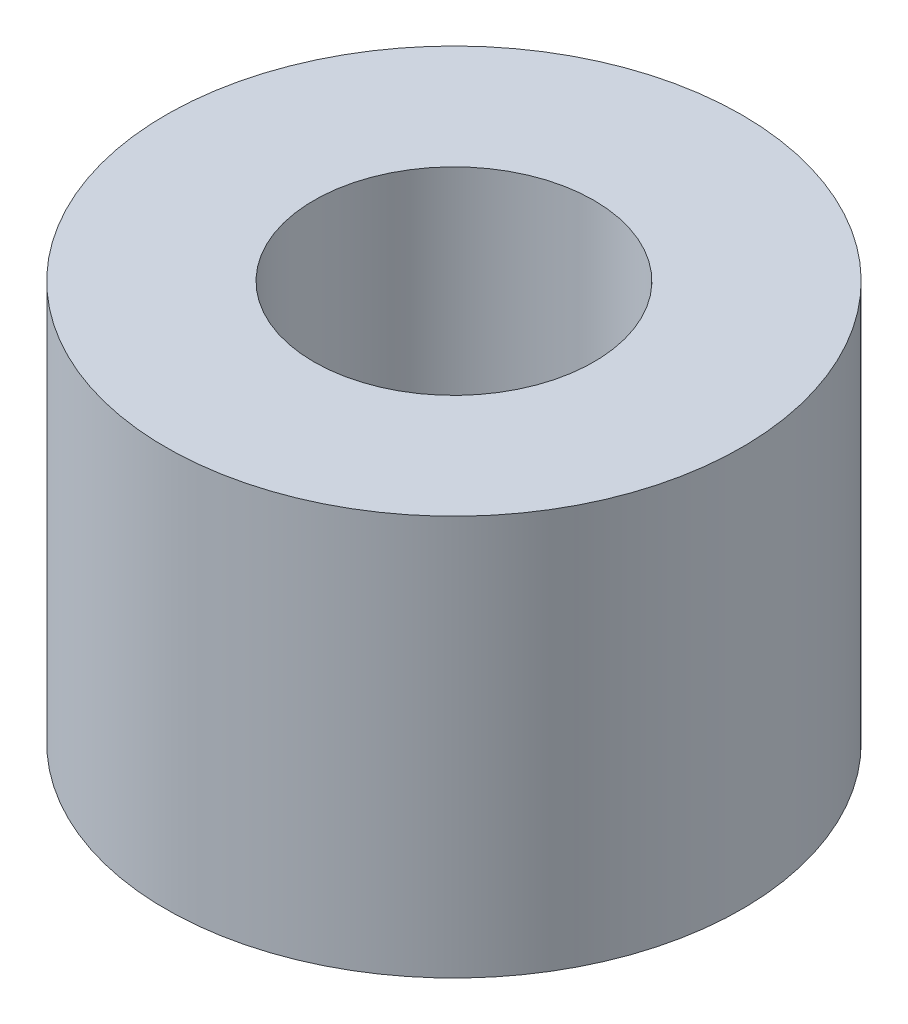
ISO-10303-21;
HEADER;
FILE_DESCRIPTION(('STEP AP214'),'2;1');
FILE_NAME('part.step','',(''),(''),'','','');
FILE_SCHEMA(('AUTOMOTIVE_DESIGN { 1 0 10303 214 1 1 1 1 }'));
ENDSEC;
DATA;
#1=APPLICATION_CONTEXT('core data for automotive mechanical design processes');
#2=APPLICATION_PROTOCOL_DEFINITION('international standard','automotive_design',2000,#1);
#3=PRODUCT_CONTEXT('',#1,'mechanical');
#4=PRODUCT('Part','Part','',(#3));
#5=PRODUCT_RELATED_PRODUCT_CATEGORY('part','',(#4));
#6=PRODUCT_DEFINITION_FORMATION('','',#4);
#7=PRODUCT_DEFINITION_CONTEXT('part definition',#1,'design');
#8=PRODUCT_DEFINITION('design','',#6,#7);
#9=PRODUCT_DEFINITION_SHAPE('','',#8);
#10=(LENGTH_UNIT() NAMED_UNIT(*) SI_UNIT(.MILLI.,.METRE.));
#11=(NAMED_UNIT(*) PLANE_ANGLE_UNIT() SI_UNIT($,.RADIAN.));
#12=(NAMED_UNIT(*) SI_UNIT($,.STERADIAN.) SOLID_ANGLE_UNIT());
#13=UNCERTAINTY_MEASURE_WITH_UNIT(LENGTH_MEASURE(1.E-05),#10,'distance_accuracy_value','');
#14=(GEOMETRIC_REPRESENTATION_CONTEXT(3) GLOBAL_UNCERTAINTY_ASSIGNED_CONTEXT((#13)) GLOBAL_UNIT_ASSIGNED_CONTEXT((#10,
#11,#12)) REPRESENTATION_CONTEXT('',''));
#15=CARTESIAN_POINT('',(0.,0.,0.));
#16=DIRECTION('',(0.,0.,1.));
#17=DIRECTION('',(1.,0.,0.));
#18=AXIS2_PLACEMENT_3D('',#15,#16,#17);
#19=CARTESIAN_POINT('',(0.,6.34999999999999,0.));
#20=DIRECTION('',(0.,-1.,0.));
#21=DIRECTION('',(0.,0.,-1.));
#22=AXIS2_PLACEMENT_3D('',#19,#20,#21);
#23=CYLINDRICAL_SURFACE('',#22,2.2225);
#24=CARTESIAN_POINT('',(0.,6.34999999999999,0.));
#25=DIRECTION('',(0.,1.,0.));
#26=DIRECTION('',(0.,0.,1.));
#27=AXIS2_PLACEMENT_3D('',#24,#25,#26);
#28=CIRCLE('',#27,2.2225);
#29=CARTESIAN_POINT('',(0.,6.34999999999999,-2.2225));
#30=VERTEX_POINT('',#29);
#31=EDGE_CURVE('E47',#30,#30,#28,.T.);
#32=CARTESIAN_POINT('',(0.,0.,0.));
#33=DIRECTION('',(0.,1.,0.));
#34=DIRECTION('',(0.,0.,1.));
#35=AXIS2_PLACEMENT_3D('',#32,#33,#34);
#36=CIRCLE('',#35,2.2225);
#37=CARTESIAN_POINT('',(0.,0.,-2.2225));
#38=VERTEX_POINT('',#37);
#39=EDGE_CURVE('E53',#38,#38,#36,.T.);
#40=CARTESIAN_POINT('',(0.,6.34999999999999,-2.2225));
#41=CARTESIAN_POINT('',(0.,6.28385416666666,-2.2225));
#42=CARTESIAN_POINT('',(0.,6.21770833333333,-2.2225));
#43=CARTESIAN_POINT('',(0.,6.08541666666666,-2.2225));
#44=CARTESIAN_POINT('',(0.,6.01927083333333,-2.2225));
#45=CARTESIAN_POINT('',(0.,5.88697916666666,-2.2225));
#46=CARTESIAN_POINT('',(0.,5.82083333333333,-2.2225));
#47=CARTESIAN_POINT('',(0.,5.68854166666666,-2.2225));
#48=CARTESIAN_POINT('',(0.,5.62239583333333,-2.2225));
#49=CARTESIAN_POINT('',(0.,5.49010416666666,-2.2225));
#50=CARTESIAN_POINT('',(0.,5.42395833333333,-2.2225));
#51=CARTESIAN_POINT('',(0.,5.29166666666666,-2.2225));
#52=CARTESIAN_POINT('',(0.,5.22552083333333,-2.2225));
#53=CARTESIAN_POINT('',(0.,5.09322916666666,-2.2225));
#54=CARTESIAN_POINT('',(0.,5.02708333333333,-2.2225));
#55=CARTESIAN_POINT('',(0.,4.89479166666666,-2.2225));
#56=CARTESIAN_POINT('',(0.,4.82864583333333,-2.2225));
#57=CARTESIAN_POINT('',(0.,4.69635416666666,-2.2225));
#58=CARTESIAN_POINT('',(0.,4.63020833333333,-2.2225));
#59=CARTESIAN_POINT('',(0.,4.49791666666666,-2.2225));
#60=CARTESIAN_POINT('',(0.,4.43177083333333,-2.2225));
#61=CARTESIAN_POINT('',(0.,4.29947916666666,-2.2225));
#62=CARTESIAN_POINT('',(0.,4.23333333333333,-2.2225));
#63=CARTESIAN_POINT('',(0.,4.10104166666666,-2.2225));
#64=CARTESIAN_POINT('',(0.,4.03489583333333,-2.2225));
#65=CARTESIAN_POINT('',(0.,3.90260416666666,-2.2225));
#66=CARTESIAN_POINT('',(0.,3.83645833333333,-2.2225));
#67=CARTESIAN_POINT('',(0.,3.70416666666666,-2.2225));
#68=CARTESIAN_POINT('',(0.,3.63802083333333,-2.2225));
#69=CARTESIAN_POINT('',(0.,3.50572916666666,-2.2225));
#70=CARTESIAN_POINT('',(0.,3.43958333333333,-2.2225));
#71=CARTESIAN_POINT('',(0.,3.30729166666666,-2.2225));
#72=CARTESIAN_POINT('',(0.,3.24114583333333,-2.2225));
#73=CARTESIAN_POINT('',(0.,3.10885416666666,-2.2225));
#74=CARTESIAN_POINT('',(0.,3.04270833333333,-2.2225));
#75=CARTESIAN_POINT('',(0.,2.91041666666666,-2.2225));
#76=CARTESIAN_POINT('',(0.,2.84427083333333,-2.2225));
#77=CARTESIAN_POINT('',(0.,2.71197916666666,-2.2225));
#78=CARTESIAN_POINT('',(0.,2.64583333333333,-2.2225));
#79=CARTESIAN_POINT('',(0.,2.51354166666666,-2.2225));
#80=CARTESIAN_POINT('',(0.,2.44739583333333,-2.2225));
#81=CARTESIAN_POINT('',(0.,2.31510416666666,-2.2225));
#82=CARTESIAN_POINT('',(0.,2.24895833333333,-2.2225));
#83=CARTESIAN_POINT('',(0.,2.11666666666666,-2.2225));
#84=CARTESIAN_POINT('',(0.,2.05052083333333,-2.2225));
#85=CARTESIAN_POINT('',(0.,1.91822916666666,-2.2225));
#86=CARTESIAN_POINT('',(0.,1.85208333333333,-2.2225));
#87=CARTESIAN_POINT('',(0.,1.71979166666666,-2.2225));
#88=CARTESIAN_POINT('',(0.,1.65364583333333,-2.2225));
#89=CARTESIAN_POINT('',(0.,1.52135416666666,-2.2225));
#90=CARTESIAN_POINT('',(0.,1.45520833333333,-2.2225));
#91=CARTESIAN_POINT('',(0.,1.32291666666666,-2.2225));
#92=CARTESIAN_POINT('',(0.,1.25677083333333,-2.2225));
#93=CARTESIAN_POINT('',(0.,1.12447916666666,-2.2225));
#94=CARTESIAN_POINT('',(0.,1.05833333333333,-2.2225));
#95=CARTESIAN_POINT('',(0.,0.926041666666665,-2.2225));
#96=CARTESIAN_POINT('',(0.,0.859895833333332,-2.2225));
#97=CARTESIAN_POINT('',(0.,0.727604166666665,-2.2225));
#98=CARTESIAN_POINT('',(0.,0.661458333333332,-2.2225));
#99=CARTESIAN_POINT('',(0.,0.529166666666665,-2.2225));
#100=CARTESIAN_POINT('',(0.,0.463020833333332,-2.2225));
#101=CARTESIAN_POINT('',(0.,0.330729166666666,-2.2225));
#102=CARTESIAN_POINT('',(0.,0.264583333333332,-2.2225));
#103=CARTESIAN_POINT('',(0.,0.132291666666666,-2.2225));
#104=CARTESIAN_POINT('',(0.,0.0661458333333324,-2.2225));
#105=CARTESIAN_POINT('',(0.,0.,-2.2225));
#106=B_SPLINE_CURVE_WITH_KNOTS('',3,(#40,#41,#42,#43,#44,#45,#46,#47,#48,#49,#50,#51,#52,#53,
#54,#55,#56,#57,#58,#59,#60,#61,#62,#63,#64,#65,#66,#67,#68,#69,#70,#71,#72,#73,#74,#75,#76,#77,
#78,#79,#80,#81,#82,#83,#84,#85,#86,#87,#88,#89,#90,#91,#92,#93,#94,#95,#96,#97,#98,#99,#100,
#101,#102,#103,#104,#105),.UNSPECIFIED.,.F.,.F.,(4,2,2,2,2,2,2,2,2,2,2,2,2,2,2,2,2,2,2,2,2,2,2,
2,2,2,2,2,2,2,2,2,4),(0.,0.1984375,0.396874999999999,0.595312499999999,0.793749999999998,
0.992187499999999,1.190625,1.3890625,1.5875,1.7859375,1.984375,2.1828125,2.38125,2.5796875,
2.778125,2.9765625,3.175,3.3734375,3.571875,3.7703125,3.96875,4.1671875,4.365625,4.5640625,
4.7625,4.9609375,5.159375,5.3578125,5.55625,5.75468749999999,5.95312499999999,6.15156249999999,
6.34999999999999),.UNSPECIFIED.);
#107=EDGE_CURVE('BSEAM40',#30,#38,#106,.T.);
#108=ORIENTED_EDGE('',*,*,#31,.T.);
#109=ORIENTED_EDGE('',*,*,#39,.F.);
#110=ORIENTED_EDGE('',*,*,#107,.T.);
#111=ORIENTED_EDGE('',*,*,#107,.F.);
#112=EDGE_LOOP('',(#108,#110,#109,#111));
#113=FACE_BOUND('',#112,.T.);
#114=ADVANCED_FACE('F40',(#113),#23,.F.);
#115=CARTESIAN_POINT('',(0.,6.34999999999999,0.));
#116=DIRECTION('',(0.,-1.,0.));
#117=DIRECTION('',(0.,0.,-1.));
#118=AXIS2_PLACEMENT_3D('',#115,#116,#117);
#119=CYLINDRICAL_SURFACE('',#118,4.572);
#120=CARTESIAN_POINT('',(0.,6.34999999999999,0.));
#121=DIRECTION('',(0.,1.,0.));
#122=DIRECTION('',(0.,0.,1.));
#123=AXIS2_PLACEMENT_3D('',#120,#121,#122);
#124=CIRCLE('',#123,4.572);
#125=CARTESIAN_POINT('',(0.,6.34999999999999,-4.572));
#126=VERTEX_POINT('',#125);
#127=EDGE_CURVE('E12',#126,#126,#124,.T.);
#128=CARTESIAN_POINT('',(0.,0.,0.));
#129=DIRECTION('',(0.,1.,0.));
#130=DIRECTION('',(0.,0.,1.));
#131=AXIS2_PLACEMENT_3D('',#128,#129,#130);
#132=CIRCLE('',#131,4.572);
#133=CARTESIAN_POINT('',(0.,0.,-4.572));
#134=VERTEX_POINT('',#133);
#135=EDGE_CURVE('E43',#134,#134,#132,.T.);
#136=CARTESIAN_POINT('',(0.,6.34999999999999,-4.572));
#137=CARTESIAN_POINT('',(0.,6.28385416666666,-4.572));
#138=CARTESIAN_POINT('',(0.,6.21770833333333,-4.572));
#139=CARTESIAN_POINT('',(0.,6.08541666666666,-4.572));
#140=CARTESIAN_POINT('',(0.,6.01927083333333,-4.572));
#141=CARTESIAN_POINT('',(0.,5.88697916666666,-4.572));
#142=CARTESIAN_POINT('',(0.,5.82083333333333,-4.572));
#143=CARTESIAN_POINT('',(0.,5.68854166666666,-4.572));
#144=CARTESIAN_POINT('',(0.,5.62239583333333,-4.572));
#145=CARTESIAN_POINT('',(0.,5.49010416666666,-4.572));
#146=CARTESIAN_POINT('',(0.,5.42395833333333,-4.572));
#147=CARTESIAN_POINT('',(0.,5.29166666666666,-4.572));
#148=CARTESIAN_POINT('',(0.,5.22552083333333,-4.572));
#149=CARTESIAN_POINT('',(0.,5.09322916666666,-4.572));
#150=CARTESIAN_POINT('',(0.,5.02708333333333,-4.572));
#151=CARTESIAN_POINT('',(0.,4.89479166666666,-4.572));
#152=CARTESIAN_POINT('',(0.,4.82864583333333,-4.572));
#153=CARTESIAN_POINT('',(0.,4.69635416666666,-4.572));
#154=CARTESIAN_POINT('',(0.,4.63020833333333,-4.572));
#155=CARTESIAN_POINT('',(0.,4.49791666666666,-4.572));
#156=CARTESIAN_POINT('',(0.,4.43177083333333,-4.572));
#157=CARTESIAN_POINT('',(0.,4.29947916666666,-4.572));
#158=CARTESIAN_POINT('',(0.,4.23333333333333,-4.572));
#159=CARTESIAN_POINT('',(0.,4.10104166666666,-4.572));
#160=CARTESIAN_POINT('',(0.,4.03489583333333,-4.572));
#161=CARTESIAN_POINT('',(0.,3.90260416666666,-4.572));
#162=CARTESIAN_POINT('',(0.,3.83645833333333,-4.572));
#163=CARTESIAN_POINT('',(0.,3.70416666666666,-4.572));
#164=CARTESIAN_POINT('',(0.,3.63802083333333,-4.572));
#165=CARTESIAN_POINT('',(0.,3.50572916666666,-4.572));
#166=CARTESIAN_POINT('',(0.,3.43958333333333,-4.572));
#167=CARTESIAN_POINT('',(0.,3.30729166666666,-4.572));
#168=CARTESIAN_POINT('',(0.,3.24114583333333,-4.572));
#169=CARTESIAN_POINT('',(0.,3.10885416666666,-4.572));
#170=CARTESIAN_POINT('',(0.,3.04270833333333,-4.572));
#171=CARTESIAN_POINT('',(0.,2.91041666666666,-4.572));
#172=CARTESIAN_POINT('',(0.,2.84427083333333,-4.572));
#173=CARTESIAN_POINT('',(0.,2.71197916666666,-4.572));
#174=CARTESIAN_POINT('',(0.,2.64583333333333,-4.572));
#175=CARTESIAN_POINT('',(0.,2.51354166666666,-4.572));
#176=CARTESIAN_POINT('',(0.,2.44739583333333,-4.572));
#177=CARTESIAN_POINT('',(0.,2.31510416666666,-4.572));
#178=CARTESIAN_POINT('',(0.,2.24895833333333,-4.572));
#179=CARTESIAN_POINT('',(0.,2.11666666666666,-4.572));
#180=CARTESIAN_POINT('',(0.,2.05052083333333,-4.572));
#181=CARTESIAN_POINT('',(0.,1.91822916666666,-4.572));
#182=CARTESIAN_POINT('',(0.,1.85208333333333,-4.572));
#183=CARTESIAN_POINT('',(0.,1.71979166666666,-4.572));
#184=CARTESIAN_POINT('',(0.,1.65364583333333,-4.572));
#185=CARTESIAN_POINT('',(0.,1.52135416666666,-4.572));
#186=CARTESIAN_POINT('',(0.,1.45520833333333,-4.572));
#187=CARTESIAN_POINT('',(0.,1.32291666666666,-4.572));
#188=CARTESIAN_POINT('',(0.,1.25677083333333,-4.572));
#189=CARTESIAN_POINT('',(0.,1.12447916666666,-4.572));
#190=CARTESIAN_POINT('',(0.,1.05833333333333,-4.572));
#191=CARTESIAN_POINT('',(0.,0.926041666666665,-4.572));
#192=CARTESIAN_POINT('',(0.,0.859895833333332,-4.572));
#193=CARTESIAN_POINT('',(0.,0.727604166666665,-4.572));
#194=CARTESIAN_POINT('',(0.,0.661458333333332,-4.572));
#195=CARTESIAN_POINT('',(0.,0.529166666666665,-4.572));
#196=CARTESIAN_POINT('',(0.,0.463020833333332,-4.572));
#197=CARTESIAN_POINT('',(0.,0.330729166666666,-4.572));
#198=CARTESIAN_POINT('',(0.,0.264583333333332,-4.572));
#199=CARTESIAN_POINT('',(0.,0.132291666666666,-4.572));
#200=CARTESIAN_POINT('',(0.,0.0661458333333324,-4.572));
#201=CARTESIAN_POINT('',(0.,0.,-4.572));
#202=B_SPLINE_CURVE_WITH_KNOTS('',3,(#136,#137,#138,#139,#140,#141,#142,#143,#144,#145,#146,
#147,#148,#149,#150,#151,#152,#153,#154,#155,#156,#157,#158,#159,#160,#161,#162,#163,#164,#165,
#166,#167,#168,#169,#170,#171,#172,#173,#174,#175,#176,#177,#178,#179,#180,#181,#182,#183,#184,
#185,#186,#187,#188,#189,#190,#191,#192,#193,#194,#195,#196,#197,#198,#199,#200,#201),
.UNSPECIFIED.,.F.,.F.,(4,2,2,2,2,2,2,2,2,2,2,2,2,2,2,2,2,2,2,2,2,2,2,2,2,2,2,2,2,2,2,2,4),(0.,
0.1984375,0.396874999999999,0.595312499999999,0.793749999999998,0.992187499999999,1.190625,
1.3890625,1.5875,1.7859375,1.984375,2.1828125,2.38125,2.5796875,2.778125,2.9765625,3.175,
3.3734375,3.571875,3.7703125,3.96875,4.1671875,4.365625,4.5640625,4.7625,4.9609375,5.159375,
5.3578125,5.55625,5.75468749999999,5.95312499999999,6.15156249999999,6.34999999999999),.UNSPECIFIED.);
#203=EDGE_CURVE('BSEAM60',#126,#134,#202,.T.);
#204=ORIENTED_EDGE('',*,*,#127,.F.);
#205=ORIENTED_EDGE('',*,*,#135,.T.);
#206=ORIENTED_EDGE('',*,*,#203,.T.);
#207=ORIENTED_EDGE('',*,*,#203,.F.);
#208=EDGE_LOOP('',(#204,#206,#205,#207));
#209=FACE_BOUND('',#208,.T.);
#210=ADVANCED_FACE('F60',(#209),#119,.T.);
#211=CARTESIAN_POINT('',(0.,6.34999999999999,0.));
#212=DIRECTION('',(0.,1.,0.));
#213=DIRECTION('',(0.,0.,1.));
#214=AXIS2_PLACEMENT_3D('',#211,#212,#213);
#215=PLANE('',#214);
#216=ORIENTED_EDGE('',*,*,#31,.F.);
#217=EDGE_LOOP('',(#216));
#218=FACE_BOUND('',#217,.T.);
#219=ORIENTED_EDGE('',*,*,#127,.T.);
#220=EDGE_LOOP('',(#219));
#221=FACE_BOUND('',#220,.T.);
#222=ADVANCED_FACE('F64',(#218,#221),#215,.T.);
#223=CARTESIAN_POINT('',(0.,0.,0.));
#224=DIRECTION('',(0.,1.,0.));
#225=DIRECTION('',(0.,0.,1.));
#226=AXIS2_PLACEMENT_3D('',#223,#224,#225);
#227=PLANE('',#226);
#228=ORIENTED_EDGE('',*,*,#39,.T.);
#229=EDGE_LOOP('',(#228));
#230=FACE_BOUND('',#229,.T.);
#231=ORIENTED_EDGE('',*,*,#135,.F.);
#232=EDGE_LOOP('',(#231));
#233=FACE_BOUND('',#232,.T.);
#234=ADVANCED_FACE('F62',(#230,#233),#227,.F.);
#235=CLOSED_SHELL('',(#114,#210,#222,#234));
#236=MANIFOLD_SOLID_BREP('B2',#235);
#237=ADVANCED_BREP_SHAPE_REPRESENTATION('',(#18,#236),#14);
#238=SHAPE_DEFINITION_REPRESENTATION(#9,#237);
ENDSEC;
END-ISO-10303-21;
